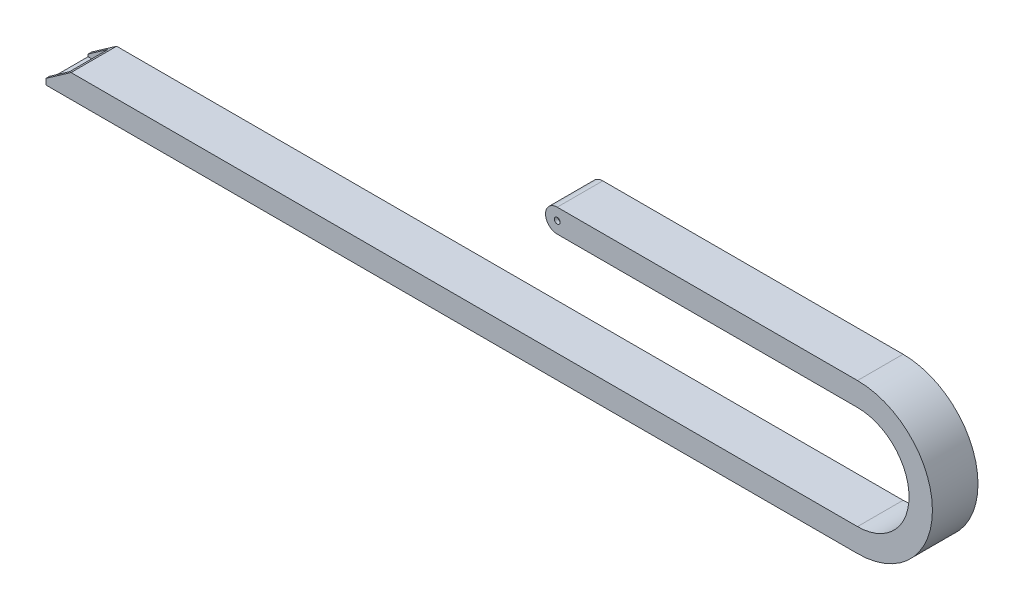
ISO-10303-21;
HEADER;
FILE_DESCRIPTION(('STEP AP214'),'2;1');
FILE_NAME('part.step','',(''),(''),'','','');
FILE_SCHEMA(('AUTOMOTIVE_DESIGN { 1 0 10303 214 1 1 1 1 }'));
ENDSEC;
DATA;
#1=APPLICATION_CONTEXT('core data for automotive mechanical design processes');
#2=APPLICATION_PROTOCOL_DEFINITION('international standard','automotive_design',2000,#1);
#3=PRODUCT_CONTEXT('',#1,'mechanical');
#4=PRODUCT('Part','Part','',(#3));
#5=PRODUCT_RELATED_PRODUCT_CATEGORY('part','',(#4));
#6=PRODUCT_DEFINITION_FORMATION('','',#4);
#7=PRODUCT_DEFINITION_CONTEXT('part definition',#1,'design');
#8=PRODUCT_DEFINITION('design','',#6,#7);
#9=PRODUCT_DEFINITION_SHAPE('','',#8);
#10=(LENGTH_UNIT() NAMED_UNIT(*) SI_UNIT(.MILLI.,.METRE.));
#11=(NAMED_UNIT(*) PLANE_ANGLE_UNIT() SI_UNIT($,.RADIAN.));
#12=(NAMED_UNIT(*) SI_UNIT($,.STERADIAN.) SOLID_ANGLE_UNIT());
#13=UNCERTAINTY_MEASURE_WITH_UNIT(LENGTH_MEASURE(1.E-05),#10,'distance_accuracy_value','');
#14=(GEOMETRIC_REPRESENTATION_CONTEXT(3) GLOBAL_UNCERTAINTY_ASSIGNED_CONTEXT((#13)) GLOBAL_UNIT_ASSIGNED_CONTEXT((#10,
#11,#12)) REPRESENTATION_CONTEXT('',''));
#15=CARTESIAN_POINT('',(0.,0.,0.));
#16=DIRECTION('',(0.,0.,1.));
#17=DIRECTION('',(1.,0.,0.));
#18=AXIS2_PLACEMENT_3D('',#15,#16,#17);
#19=CARTESIAN_POINT('',(-287.036202121073,-201.25,39.));
#20=DIRECTION('',(0.573576436351048,-0.819152044288991,0.));
#21=DIRECTION('',(0.819152044288991,0.573576436351048,0.));
#22=AXIS2_PLACEMENT_3D('',#19,#20,#21);
#23=PLANE('',#22);
#24=DIRECTION('',(-0.819152044288991,-0.573576436351048,0.));
#25=VECTOR('',#24,1.);
#26=CARTESIAN_POINT('',(-287.036202121073,-201.25,36.));
#27=LINE('',#26,#25);
#28=CARTESIAN_POINT('',(-291.3206461413,-204.25,36.));
#29=VERTEX_POINT('',#28);
#30=CARTESIAN_POINT('',(-308.458422222205,-216.25,36.));
#31=VERTEX_POINT('',#30);
#32=EDGE_CURVE('E56',#29,#31,#27,.T.);
#33=ORIENTED_EDGE('',*,*,#32,.T.);
#34=DIRECTION('',(0.,0.,-1.));
#35=VECTOR('',#34,1.);
#36=CARTESIAN_POINT('',(-308.458422222205,-216.25,39.));
#37=LINE('',#36,#35);
#38=CARTESIAN_POINT('',(-308.458422222205,-216.25,39.));
#39=VERTEX_POINT('',#38);
#40=EDGE_CURVE('E11',#39,#31,#37,.T.);
#41=ORIENTED_EDGE('',*,*,#40,.F.);
#42=DIRECTION('',(-0.819152044288991,-0.573576436351048,0.));
#43=VECTOR('',#42,1.);
#44=CARTESIAN_POINT('',(-287.036202121073,-201.25,39.));
#45=LINE('',#44,#43);
#46=CARTESIAN_POINT('',(-287.036202121073,-201.25,39.));
#47=VERTEX_POINT('',#46);
#48=EDGE_CURVE('E230',#47,#39,#45,.T.);
#49=ORIENTED_EDGE('',*,*,#48,.F.);
#50=DIRECTION('',(0.,0.,-1.));
#51=VECTOR('',#50,1.);
#52=CARTESIAN_POINT('',(-287.036202121073,-201.25,39.));
#53=LINE('',#52,#51);
#54=CARTESIAN_POINT('',(-287.036202121073,-201.25,0.));
#55=VERTEX_POINT('',#54);
#56=EDGE_CURVE('E250',#47,#55,#53,.T.);
#57=ORIENTED_EDGE('',*,*,#56,.T.);
#58=DIRECTION('',(-0.819152044288991,-0.573576436351048,0.));
#59=VECTOR('',#58,1.);
#60=CARTESIAN_POINT('',(-287.036202121073,-201.25,0.));
#61=LINE('',#60,#59);
#62=CARTESIAN_POINT('',(-308.458422222205,-216.25,0.));
#63=VERTEX_POINT('',#62);
#64=EDGE_CURVE('E196',#55,#63,#61,.T.);
#65=ORIENTED_EDGE('',*,*,#64,.T.);
#66=CARTESIAN_POINT('',(-308.458422222205,-216.25,3.));
#67=VERTEX_POINT('',#66);
#68=EDGE_CURVE('E41',#67,#63,#37,.T.);
#69=ORIENTED_EDGE('',*,*,#68,.F.);
#70=DIRECTION('',(-0.819152044288991,-0.573576436351048,0.));
#71=VECTOR('',#70,1.);
#72=CARTESIAN_POINT('',(-287.036202121073,-201.25,3.));
#73=LINE('',#72,#71);
#74=CARTESIAN_POINT('',(-291.3206461413,-204.25,3.));
#75=VERTEX_POINT('',#74);
#76=EDGE_CURVE('E171',#75,#67,#73,.T.);
#77=ORIENTED_EDGE('',*,*,#76,.F.);
#78=DIRECTION('',(0.,0.,-1.));
#79=VECTOR('',#78,1.);
#80=CARTESIAN_POINT('',(-291.3206461413,-204.25,39.));
#81=LINE('',#80,#79);
#82=EDGE_CURVE('E221',#29,#75,#81,.T.);
#83=ORIENTED_EDGE('',*,*,#82,.F.);
#84=EDGE_LOOP('',(#33,#41,#49,#57,#65,#69,#77,#83));
#85=FACE_BOUND('',#84,.T.);
#86=ADVANCED_FACE('F33',(#85),#23,.F.);
#87=CARTESIAN_POINT('',(-308.458422222205,-216.25,39.));
#88=DIRECTION('',(1.,0.,0.));
#89=DIRECTION('',(0.,0.,-1.));
#90=AXIS2_PLACEMENT_3D('',#87,#88,#89);
#91=PLANE('',#90);
#92=DIRECTION('',(0.,1.,0.));
#93=VECTOR('',#92,1.);
#94=CARTESIAN_POINT('',(-308.458422222205,-204.25,36.));
#95=LINE('',#94,#93);
#96=CARTESIAN_POINT('',(-308.458422222205,-218.25,36.));
#97=VERTEX_POINT('',#96);
#98=EDGE_CURVE('E179',#97,#31,#95,.T.);
#99=ORIENTED_EDGE('',*,*,#98,.F.);
#100=DIRECTION('',(0.,0.,1.));
#101=VECTOR('',#100,1.);
#102=CARTESIAN_POINT('',(-308.458422222205,-218.25,36.));
#103=LINE('',#102,#101);
#104=CARTESIAN_POINT('',(-308.458422222205,-218.25,3.));
#105=VERTEX_POINT('',#104);
#106=EDGE_CURVE('E164',#105,#97,#103,.T.);
#107=ORIENTED_EDGE('',*,*,#106,.F.);
#108=DIRECTION('',(0.,-1.,0.));
#109=VECTOR('',#108,1.);
#110=CARTESIAN_POINT('',(-308.458422222205,-204.25,3.));
#111=LINE('',#110,#109);
#112=EDGE_CURVE('E174',#67,#105,#111,.T.);
#113=ORIENTED_EDGE('',*,*,#112,.F.);
#114=ORIENTED_EDGE('',*,*,#68,.T.);
#115=DIRECTION('',(0.,-1.,0.));
#116=VECTOR('',#115,1.);
#117=CARTESIAN_POINT('',(-308.458422222205,-216.25,0.));
#118=LINE('',#117,#116);
#119=CARTESIAN_POINT('',(-308.458422222205,-221.25,0.));
#120=VERTEX_POINT('',#119);
#121=EDGE_CURVE('E253',#63,#120,#118,.T.);
#122=ORIENTED_EDGE('',*,*,#121,.T.);
#123=DIRECTION('',(0.,0.,-1.));
#124=VECTOR('',#123,1.);
#125=CARTESIAN_POINT('',(-308.458422222205,-221.25,39.));
#126=LINE('',#125,#124);
#127=CARTESIAN_POINT('',(-308.458422222205,-221.25,39.));
#128=VERTEX_POINT('',#127);
#129=EDGE_CURVE('E288',#128,#120,#126,.T.);
#130=ORIENTED_EDGE('',*,*,#129,.F.);
#131=DIRECTION('',(0.,-1.,0.));
#132=VECTOR('',#131,1.);
#133=CARTESIAN_POINT('',(-308.458422222205,-216.25,39.));
#134=LINE('',#133,#132);
#135=EDGE_CURVE('E233',#39,#128,#134,.T.);
#136=ORIENTED_EDGE('',*,*,#135,.F.);
#137=ORIENTED_EDGE('',*,*,#40,.T.);
#138=EDGE_LOOP('',(#99,#107,#113,#114,#122,#130,#136,#137));
#139=FACE_BOUND('',#138,.T.);
#140=ADVANCED_FACE('F181',(#139),#91,.F.);
#141=CARTESIAN_POINT('',(129.,-103.,39.));
#142=DIRECTION('',(0.,0.,-1.));
#143=DIRECTION('',(-1.,0.,0.));
#144=AXIS2_PLACEMENT_3D('',#141,#142,#143);
#145=CYLINDRICAL_SURFACE('',#144,10.);
#146=CARTESIAN_POINT('',(129.,-103.,0.));
#147=DIRECTION('',(0.,0.,1.));
#148=DIRECTION('',(1.,0.,0.));
#149=AXIS2_PLACEMENT_3D('',#146,#147,#148);
#150=CIRCLE('',#149,10.);
#151=CARTESIAN_POINT('',(129.,-93.,0.));
#152=VERTEX_POINT('',#151);
#153=CARTESIAN_POINT('',(129.,-113.,0.));
#154=VERTEX_POINT('',#153);
#155=EDGE_CURVE('E261',#152,#154,#150,.T.);
#156=ORIENTED_EDGE('',*,*,#155,.T.);
#157=DIRECTION('',(0.,0.,-1.));
#158=VECTOR('',#157,1.);
#159=CARTESIAN_POINT('',(129.,-113.,39.));
#160=LINE('',#159,#158);
#161=CARTESIAN_POINT('',(129.,-113.,39.));
#162=VERTEX_POINT('',#161);
#163=EDGE_CURVE('E276',#162,#154,#160,.T.);
#164=ORIENTED_EDGE('',*,*,#163,.F.);
#165=CARTESIAN_POINT('',(129.,-103.,39.));
#166=DIRECTION('',(0.,0.,1.));
#167=DIRECTION('',(1.,0.,0.));
#168=AXIS2_PLACEMENT_3D('',#165,#166,#167);
#169=CIRCLE('',#168,10.);
#170=CARTESIAN_POINT('',(129.,-93.,39.));
#171=VERTEX_POINT('',#170);
#172=EDGE_CURVE('E242',#171,#162,#169,.T.);
#173=ORIENTED_EDGE('',*,*,#172,.F.);
#174=DIRECTION('',(0.,0.,-1.));
#175=VECTOR('',#174,1.);
#176=CARTESIAN_POINT('',(129.,-93.,39.));
#177=LINE('',#176,#175);
#178=EDGE_CURVE('E279',#171,#152,#177,.T.);
#179=ORIENTED_EDGE('',*,*,#178,.T.);
#180=EDGE_LOOP('',(#156,#164,#173,#179));
#181=FACE_BOUND('',#180,.T.);
#182=CARTESIAN_POINT('',(129.,-103.,36.));
#183=DIRECTION('',(0.,0.,-1.));
#184=DIRECTION('',(-1.,0.,0.));
#185=AXIS2_PLACEMENT_3D('',#182,#183,#184);
#186=CIRCLE('',#185,10.);
#187=CARTESIAN_POINT('',(121.858571571457,-110.,36.));
#188=VERTEX_POINT('',#187);
#189=CARTESIAN_POINT('',(121.858571571457,-96.,36.));
#190=VERTEX_POINT('',#189);
#191=EDGE_CURVE('E192',#188,#190,#186,.T.);
#192=ORIENTED_EDGE('',*,*,#191,.F.);
#193=DIRECTION('',(0.,0.,-1.));
#194=VECTOR('',#193,1.);
#195=CARTESIAN_POINT('',(121.858571571457,-110.,39.));
#196=LINE('',#195,#194);
#197=CARTESIAN_POINT('',(121.858571571457,-110.,3.));
#198=VERTEX_POINT('',#197);
#199=EDGE_CURVE('E182',#198,#188,#196,.F.);
#200=ORIENTED_EDGE('',*,*,#199,.F.);
#201=CARTESIAN_POINT('',(129.,-103.,3.));
#202=DIRECTION('',(0.,0.,1.));
#203=DIRECTION('',(1.,0.,0.));
#204=AXIS2_PLACEMENT_3D('',#201,#202,#203);
#205=CIRCLE('',#204,10.);
#206=CARTESIAN_POINT('',(121.858571571457,-96.,3.));
#207=VERTEX_POINT('',#206);
#208=EDGE_CURVE('E190',#207,#198,#205,.T.);
#209=ORIENTED_EDGE('',*,*,#208,.F.);
#210=DIRECTION('',(0.,0.,-1.));
#211=VECTOR('',#210,1.);
#212=CARTESIAN_POINT('',(121.858571571457,-96.,39.));
#213=LINE('',#212,#211);
#214=EDGE_CURVE('E184',#190,#207,#213,.T.);
#215=ORIENTED_EDGE('',*,*,#214,.F.);
#216=EDGE_LOOP('',(#192,#200,#209,#215));
#217=FACE_BOUND('',#216,.T.);
#218=ADVANCED_FACE('F321',(#181,#217),#145,.T.);
#219=CARTESIAN_POINT('',(-308.458422222205,-221.25,39.));
#220=DIRECTION('',(0.,1.,0.));
#221=DIRECTION('',(-1.,0.,0.));
#222=AXIS2_PLACEMENT_3D('',#219,#220,#221);
#223=PLANE('',#222);
#224=DIRECTION('',(1.,0.,0.));
#225=VECTOR('',#224,1.);
#226=CARTESIAN_POINT('',(-308.458422222205,-221.25,0.));
#227=LINE('',#226,#225);
#228=CARTESIAN_POINT('',(385.962547751689,-221.25,0.));
#229=VERTEX_POINT('',#228);
#230=EDGE_CURVE('E255',#120,#229,#227,.T.);
#231=ORIENTED_EDGE('',*,*,#230,.T.);
#232=DIRECTION('',(0.,0.,-1.));
#233=VECTOR('',#232,1.);
#234=CARTESIAN_POINT('',(385.962547751689,-221.25,39.));
#235=LINE('',#234,#233);
#236=CARTESIAN_POINT('',(385.962547751689,-221.25,39.));
#237=VERTEX_POINT('',#236);
#238=EDGE_CURVE('E285',#237,#229,#235,.T.);
#239=ORIENTED_EDGE('',*,*,#238,.F.);
#240=DIRECTION('',(1.,0.,0.));
#241=VECTOR('',#240,1.);
#242=CARTESIAN_POINT('',(-308.458422222205,-221.25,39.));
#243=LINE('',#242,#241);
#244=EDGE_CURVE('E236',#128,#237,#243,.T.);
#245=ORIENTED_EDGE('',*,*,#244,.F.);
#246=ORIENTED_EDGE('',*,*,#129,.T.);
#247=EDGE_LOOP('',(#231,#239,#245,#246));
#248=FACE_BOUND('',#247,.T.);
#249=ADVANCED_FACE('F333',(#248),#223,.F.);
#250=CARTESIAN_POINT('',(385.962547751689,-157.125,39.));
#251=DIRECTION('',(0.,0.,-1.));
#252=DIRECTION('',(-1.,0.,0.));
#253=AXIS2_PLACEMENT_3D('',#250,#251,#252);
#254=CYLINDRICAL_SURFACE('',#253,64.125);
#255=CARTESIAN_POINT('',(385.962547751689,-157.125,0.));
#256=DIRECTION('',(0.,0.,1.));
#257=DIRECTION('',(1.,0.,0.));
#258=AXIS2_PLACEMENT_3D('',#255,#256,#257);
#259=CIRCLE('',#258,64.125);
#260=CARTESIAN_POINT('',(385.962547751689,-93.,0.));
#261=VERTEX_POINT('',#260);
#262=EDGE_CURVE('E257',#229,#261,#259,.T.);
#263=ORIENTED_EDGE('',*,*,#262,.T.);
#264=DIRECTION('',(0.,0.,-1.));
#265=VECTOR('',#264,1.);
#266=CARTESIAN_POINT('',(385.962547751689,-93.,39.));
#267=LINE('',#266,#265);
#268=CARTESIAN_POINT('',(385.962547751689,-93.,39.));
#269=VERTEX_POINT('',#268);
#270=EDGE_CURVE('E282',#269,#261,#267,.T.);
#271=ORIENTED_EDGE('',*,*,#270,.F.);
#272=CARTESIAN_POINT('',(385.962547751689,-157.125,39.));
#273=DIRECTION('',(0.,0.,1.));
#274=DIRECTION('',(1.,0.,0.));
#275=AXIS2_PLACEMENT_3D('',#272,#273,#274);
#276=CIRCLE('',#275,64.125);
#277=EDGE_CURVE('E238',#237,#269,#276,.T.);
#278=ORIENTED_EDGE('',*,*,#277,.F.);
#279=ORIENTED_EDGE('',*,*,#238,.T.);
#280=EDGE_LOOP('',(#263,#271,#278,#279));
#281=FACE_BOUND('',#280,.T.);
#282=ADVANCED_FACE('F331',(#281),#254,.T.);
#283=CARTESIAN_POINT('',(385.962547751689,-93.,39.));
#284=DIRECTION('',(0.,-1.,0.));
#285=DIRECTION('',(1.,0.,0.));
#286=AXIS2_PLACEMENT_3D('',#283,#284,#285);
#287=PLANE('',#286);
#288=DIRECTION('',(-1.,0.,0.));
#289=VECTOR('',#288,1.);
#290=CARTESIAN_POINT('',(385.962547751689,-93.,0.));
#291=LINE('',#290,#289);
#292=EDGE_CURVE('E259',#261,#152,#291,.T.);
#293=ORIENTED_EDGE('',*,*,#292,.T.);
#294=ORIENTED_EDGE('',*,*,#178,.F.);
#295=DIRECTION('',(-1.,0.,0.));
#296=VECTOR('',#295,1.);
#297=CARTESIAN_POINT('',(385.962547751689,-93.,39.));
#298=LINE('',#297,#296);
#299=EDGE_CURVE('E240',#269,#171,#298,.T.);
#300=ORIENTED_EDGE('',*,*,#299,.F.);
#301=ORIENTED_EDGE('',*,*,#270,.T.);
#302=EDGE_LOOP('',(#293,#294,#300,#301));
#303=FACE_BOUND('',#302,.T.);
#304=ADVANCED_FACE('F326',(#303),#287,.F.);
#305=CARTESIAN_POINT('',(129.,-113.,39.));
#306=DIRECTION('',(0.,1.,0.));
#307=DIRECTION('',(0.,0.,1.));
#308=AXIS2_PLACEMENT_3D('',#305,#306,#307);
#309=PLANE('',#308);
#310=DIRECTION('',(1.,0.,0.));
#311=VECTOR('',#310,1.);
#312=CARTESIAN_POINT('',(129.,-113.,0.));
#313=LINE('',#312,#311);
#314=CARTESIAN_POINT('',(385.962547751689,-113.,0.));
#315=VERTEX_POINT('',#314);
#316=EDGE_CURVE('E263',#154,#315,#313,.T.);
#317=ORIENTED_EDGE('',*,*,#316,.T.);
#318=DIRECTION('',(0.,0.,-1.));
#319=VECTOR('',#318,1.);
#320=CARTESIAN_POINT('',(385.962547751689,-113.,39.));
#321=LINE('',#320,#319);
#322=CARTESIAN_POINT('',(385.962547751689,-113.,39.));
#323=VERTEX_POINT('',#322);
#324=EDGE_CURVE('E273',#323,#315,#321,.T.);
#325=ORIENTED_EDGE('',*,*,#324,.F.);
#326=DIRECTION('',(1.,0.,0.));
#327=VECTOR('',#326,1.);
#328=CARTESIAN_POINT('',(129.,-113.,39.));
#329=LINE('',#328,#327);
#330=EDGE_CURVE('E244',#162,#323,#329,.T.);
#331=ORIENTED_EDGE('',*,*,#330,.F.);
#332=ORIENTED_EDGE('',*,*,#163,.T.);
#333=EDGE_LOOP('',(#317,#325,#331,#332));
#334=FACE_BOUND('',#333,.T.);
#335=ADVANCED_FACE('F317',(#334),#309,.F.);
#336=CARTESIAN_POINT('',(385.962547751689,-157.125,39.));
#337=DIRECTION('',(0.,0.,-1.));
#338=DIRECTION('',(-1.,0.,0.));
#339=AXIS2_PLACEMENT_3D('',#336,#337,#338);
#340=CYLINDRICAL_SURFACE('',#339,44.125);
#341=CARTESIAN_POINT('',(385.962547751689,-157.125,0.));
#342=DIRECTION('',(0.,0.,-1.));
#343=DIRECTION('',(1.,0.,0.));
#344=AXIS2_PLACEMENT_3D('',#341,#342,#343);
#345=CIRCLE('',#344,44.125);
#346=CARTESIAN_POINT('',(385.962547751689,-201.25,0.));
#347=VERTEX_POINT('',#346);
#348=EDGE_CURVE('E265',#315,#347,#345,.T.);
#349=ORIENTED_EDGE('',*,*,#348,.T.);
#350=DIRECTION('',(0.,0.,-1.));
#351=VECTOR('',#350,1.);
#352=CARTESIAN_POINT('',(385.962547751689,-201.25,39.));
#353=LINE('',#352,#351);
#354=CARTESIAN_POINT('',(385.962547751689,-201.25,39.));
#355=VERTEX_POINT('',#354);
#356=EDGE_CURVE('E270',#355,#347,#353,.T.);
#357=ORIENTED_EDGE('',*,*,#356,.F.);
#358=CARTESIAN_POINT('',(385.962547751689,-157.125,39.));
#359=DIRECTION('',(0.,0.,-1.));
#360=DIRECTION('',(1.,0.,0.));
#361=AXIS2_PLACEMENT_3D('',#358,#359,#360);
#362=CIRCLE('',#361,44.125);
#363=EDGE_CURVE('E246',#323,#355,#362,.T.);
#364=ORIENTED_EDGE('',*,*,#363,.F.);
#365=ORIENTED_EDGE('',*,*,#324,.T.);
#366=EDGE_LOOP('',(#349,#357,#364,#365));
#367=FACE_BOUND('',#366,.T.);
#368=ADVANCED_FACE('F312',(#367),#340,.F.);
#369=CARTESIAN_POINT('',(385.962547751689,-201.25,39.));
#370=DIRECTION('',(0.,-1.,0.));
#371=DIRECTION('',(1.,0.,0.));
#372=AXIS2_PLACEMENT_3D('',#369,#370,#371);
#373=PLANE('',#372);
#374=DIRECTION('',(-1.,0.,0.));
#375=VECTOR('',#374,1.);
#376=CARTESIAN_POINT('',(385.962547751689,-201.25,0.));
#377=LINE('',#376,#375);
#378=EDGE_CURVE('E234',#347,#55,#377,.T.);
#379=ORIENTED_EDGE('',*,*,#378,.T.);
#380=ORIENTED_EDGE('',*,*,#56,.F.);
#381=DIRECTION('',(-1.,0.,0.));
#382=VECTOR('',#381,1.);
#383=CARTESIAN_POINT('',(385.962547751689,-201.25,39.));
#384=LINE('',#383,#382);
#385=EDGE_CURVE('E248',#355,#47,#384,.T.);
#386=ORIENTED_EDGE('',*,*,#385,.F.);
#387=ORIENTED_EDGE('',*,*,#356,.T.);
#388=EDGE_LOOP('',(#379,#380,#386,#387));
#389=FACE_BOUND('',#388,.T.);
#390=ADVANCED_FACE('F306',(#389),#373,.F.);
#391=CARTESIAN_POINT('',(385.962547751689,-157.125,39.));
#392=DIRECTION('',(0.,0.,1.));
#393=DIRECTION('',(1.,0.,0.));
#394=AXIS2_PLACEMENT_3D('',#391,#392,#393);
#395=PLANE('',#394);
#396=CARTESIAN_POINT('',(129.,-103.,39.));
#397=DIRECTION('',(0.,0.,1.));
#398=DIRECTION('',(1.,0.,0.));
#399=AXIS2_PLACEMENT_3D('',#396,#397,#398);
#400=CIRCLE('',#399,2.50000000000002);
#401=CARTESIAN_POINT('',(131.5,-103.,39.));
#402=VERTEX_POINT('',#401);
#403=EDGE_CURVE('E344',#402,#402,#400,.T.);
#404=ORIENTED_EDGE('',*,*,#403,.F.);
#405=EDGE_LOOP('',(#404));
#406=FACE_BOUND('',#405,.T.);
#407=ORIENTED_EDGE('',*,*,#48,.T.);
#408=ORIENTED_EDGE('',*,*,#135,.T.);
#409=ORIENTED_EDGE('',*,*,#244,.T.);
#410=ORIENTED_EDGE('',*,*,#277,.T.);
#411=ORIENTED_EDGE('',*,*,#299,.T.);
#412=ORIENTED_EDGE('',*,*,#172,.T.);
#413=ORIENTED_EDGE('',*,*,#330,.T.);
#414=ORIENTED_EDGE('',*,*,#363,.T.);
#415=ORIENTED_EDGE('',*,*,#385,.T.);
#416=EDGE_LOOP('',(#407,#408,#409,#410,#411,#412,#413,#414,#415));
#417=FACE_BOUND('',#416,.T.);
#418=ADVANCED_FACE('F335',(#406,#417),#395,.T.);
#419=CARTESIAN_POINT('',(385.962547751689,-157.125,0.));
#420=DIRECTION('',(0.,0.,1.));
#421=DIRECTION('',(1.,0.,0.));
#422=AXIS2_PLACEMENT_3D('',#419,#420,#421);
#423=PLANE('',#422);
#424=CARTESIAN_POINT('',(129.,-103.,0.));
#425=DIRECTION('',(0.,0.,1.));
#426=DIRECTION('',(1.,0.,0.));
#427=AXIS2_PLACEMENT_3D('',#424,#425,#426);
#428=CIRCLE('',#427,2.50000000000002);
#429=CARTESIAN_POINT('',(131.5,-103.,0.));
#430=VERTEX_POINT('',#429);
#431=EDGE_CURVE('E347',#430,#430,#428,.T.);
#432=ORIENTED_EDGE('',*,*,#431,.T.);
#433=EDGE_LOOP('',(#432));
#434=FACE_BOUND('',#433,.T.);
#435=ORIENTED_EDGE('',*,*,#64,.F.);
#436=ORIENTED_EDGE('',*,*,#378,.F.);
#437=ORIENTED_EDGE('',*,*,#348,.F.);
#438=ORIENTED_EDGE('',*,*,#316,.F.);
#439=ORIENTED_EDGE('',*,*,#155,.F.);
#440=ORIENTED_EDGE('',*,*,#292,.F.);
#441=ORIENTED_EDGE('',*,*,#262,.F.);
#442=ORIENTED_EDGE('',*,*,#230,.F.);
#443=ORIENTED_EDGE('',*,*,#121,.F.);
#444=EDGE_LOOP('',(#435,#436,#437,#438,#439,#440,#441,#442,#443));
#445=FACE_BOUND('',#444,.T.);
#446=ADVANCED_FACE('F298',(#434,#445),#423,.F.);
#447=CARTESIAN_POINT('',(-308.458422222205,-218.25,39.));
#448=DIRECTION('',(0.,1.,0.));
#449=DIRECTION('',(-1.,0.,0.));
#450=AXIS2_PLACEMENT_3D('',#447,#448,#449);
#451=PLANE('',#450);
#452=DIRECTION('',(1.,0.,0.));
#453=VECTOR('',#452,1.);
#454=CARTESIAN_POINT('',(-308.458422222205,-218.25,3.));
#455=LINE('',#454,#453);
#456=CARTESIAN_POINT('',(385.962547751689,-218.25,3.));
#457=VERTEX_POINT('',#456);
#458=EDGE_CURVE('E160',#105,#457,#455,.T.);
#459=ORIENTED_EDGE('',*,*,#458,.F.);
#460=ORIENTED_EDGE('',*,*,#106,.T.);
#461=DIRECTION('',(1.,0.,0.));
#462=VECTOR('',#461,1.);
#463=CARTESIAN_POINT('',(-308.458422222205,-218.25,36.));
#464=LINE('',#463,#462);
#465=CARTESIAN_POINT('',(385.962547751689,-218.25,36.));
#466=VERTEX_POINT('',#465);
#467=EDGE_CURVE('E198',#97,#466,#464,.T.);
#468=ORIENTED_EDGE('',*,*,#467,.T.);
#469=DIRECTION('',(0.,0.,-1.));
#470=VECTOR('',#469,1.);
#471=CARTESIAN_POINT('',(385.962547751689,-218.25,39.));
#472=LINE('',#471,#470);
#473=EDGE_CURVE('E167',#466,#457,#472,.T.);
#474=ORIENTED_EDGE('',*,*,#473,.T.);
#475=EDGE_LOOP('',(#459,#460,#468,#474));
#476=FACE_BOUND('',#475,.T.);
#477=ADVANCED_FACE('F162',(#476),#451,.T.);
#478=CARTESIAN_POINT('',(385.962547751689,-157.125,39.));
#479=DIRECTION('',(0.,0.,-1.));
#480=DIRECTION('',(-1.,0.,0.));
#481=AXIS2_PLACEMENT_3D('',#478,#479,#480);
#482=CYLINDRICAL_SURFACE('',#481,61.125);
#483=CARTESIAN_POINT('',(385.962547751689,-157.125,3.));
#484=DIRECTION('',(0.,0.,1.));
#485=DIRECTION('',(1.,0.,0.));
#486=AXIS2_PLACEMENT_3D('',#483,#484,#485);
#487=CIRCLE('',#486,61.125);
#488=CARTESIAN_POINT('',(385.962547751689,-96.,3.));
#489=VERTEX_POINT('',#488);
#490=EDGE_CURVE('E170',#457,#489,#487,.T.);
#491=ORIENTED_EDGE('',*,*,#490,.F.);
#492=ORIENTED_EDGE('',*,*,#473,.F.);
#493=CARTESIAN_POINT('',(385.962547751689,-157.125,36.));
#494=DIRECTION('',(0.,0.,1.));
#495=DIRECTION('',(1.,0.,0.));
#496=AXIS2_PLACEMENT_3D('',#493,#494,#495);
#497=CIRCLE('',#496,61.125);
#498=CARTESIAN_POINT('',(385.962547751689,-96.,36.));
#499=VERTEX_POINT('',#498);
#500=EDGE_CURVE('E200',#466,#499,#497,.T.);
#501=ORIENTED_EDGE('',*,*,#500,.T.);
#502=DIRECTION('',(0.,0.,1.));
#503=VECTOR('',#502,1.);
#504=CARTESIAN_POINT('',(385.962547751689,-96.,39.));
#505=LINE('',#504,#503);
#506=EDGE_CURVE('E197',#499,#489,#505,.F.);
#507=ORIENTED_EDGE('',*,*,#506,.T.);
#508=EDGE_LOOP('',(#491,#492,#501,#507));
#509=FACE_BOUND('',#508,.T.);
#510=ADVANCED_FACE('F405',(#509),#482,.F.);
#511=CARTESIAN_POINT('',(385.962547751689,-96.,39.));
#512=DIRECTION('',(0.,-1.,0.));
#513=DIRECTION('',(1.,0.,0.));
#514=AXIS2_PLACEMENT_3D('',#511,#512,#513);
#515=PLANE('',#514);
#516=DIRECTION('',(-1.,0.,0.));
#517=VECTOR('',#516,1.);
#518=CARTESIAN_POINT('',(385.962547751689,-96.,3.));
#519=LINE('',#518,#517);
#520=EDGE_CURVE('E202',#489,#207,#519,.T.);
#521=ORIENTED_EDGE('',*,*,#520,.F.);
#522=ORIENTED_EDGE('',*,*,#506,.F.);
#523=DIRECTION('',(-1.,0.,0.));
#524=VECTOR('',#523,1.);
#525=CARTESIAN_POINT('',(385.962547751689,-96.,36.));
#526=LINE('',#525,#524);
#527=EDGE_CURVE('E207',#499,#190,#526,.T.);
#528=ORIENTED_EDGE('',*,*,#527,.T.);
#529=ORIENTED_EDGE('',*,*,#214,.T.);
#530=EDGE_LOOP('',(#521,#522,#528,#529));
#531=FACE_BOUND('',#530,.T.);
#532=ADVANCED_FACE('F408',(#531),#515,.T.);
#533=CARTESIAN_POINT('',(129.,-110.,39.));
#534=DIRECTION('',(0.,1.,0.));
#535=DIRECTION('',(0.,0.,1.));
#536=AXIS2_PLACEMENT_3D('',#533,#534,#535);
#537=PLANE('',#536);
#538=DIRECTION('',(1.,0.,0.));
#539=VECTOR('',#538,1.);
#540=CARTESIAN_POINT('',(129.,-110.,3.));
#541=LINE('',#540,#539);
#542=CARTESIAN_POINT('',(385.962547751689,-110.,3.));
#543=VERTEX_POINT('',#542);
#544=EDGE_CURVE('E48',#198,#543,#541,.T.);
#545=ORIENTED_EDGE('',*,*,#544,.F.);
#546=ORIENTED_EDGE('',*,*,#199,.T.);
#547=DIRECTION('',(1.,0.,0.));
#548=VECTOR('',#547,1.);
#549=CARTESIAN_POINT('',(129.,-110.,36.));
#550=LINE('',#549,#548);
#551=CARTESIAN_POINT('',(385.962547751689,-110.,36.));
#552=VERTEX_POINT('',#551);
#553=EDGE_CURVE('E210',#188,#552,#550,.T.);
#554=ORIENTED_EDGE('',*,*,#553,.T.);
#555=DIRECTION('',(0.,0.,-1.));
#556=VECTOR('',#555,1.);
#557=CARTESIAN_POINT('',(385.962547751689,-110.,39.));
#558=LINE('',#557,#556);
#559=EDGE_CURVE('E205',#552,#543,#558,.T.);
#560=ORIENTED_EDGE('',*,*,#559,.T.);
#561=EDGE_LOOP('',(#545,#546,#554,#560));
#562=FACE_BOUND('',#561,.T.);
#563=ADVANCED_FACE('F412',(#562),#537,.T.);
#564=CARTESIAN_POINT('',(385.962547751689,-157.125,39.));
#565=DIRECTION('',(0.,0.,-1.));
#566=DIRECTION('',(-1.,0.,0.));
#567=AXIS2_PLACEMENT_3D('',#564,#565,#566);
#568=CYLINDRICAL_SURFACE('',#567,47.1250000000001);
#569=CARTESIAN_POINT('',(385.962547751689,-157.125,3.));
#570=DIRECTION('',(0.,0.,1.));
#571=DIRECTION('',(1.,0.,0.));
#572=AXIS2_PLACEMENT_3D('',#569,#570,#571);
#573=CIRCLE('',#572,47.1250000000001);
#574=CARTESIAN_POINT('',(385.962547751689,-204.25,3.));
#575=VERTEX_POINT('',#574);
#576=EDGE_CURVE('E212',#543,#575,#573,.F.);
#577=ORIENTED_EDGE('',*,*,#576,.F.);
#578=ORIENTED_EDGE('',*,*,#559,.F.);
#579=CARTESIAN_POINT('',(385.962547751689,-157.125,36.));
#580=DIRECTION('',(0.,0.,1.));
#581=DIRECTION('',(1.,0.,0.));
#582=AXIS2_PLACEMENT_3D('',#579,#580,#581);
#583=CIRCLE('',#582,47.1250000000001);
#584=CARTESIAN_POINT('',(385.962547751689,-204.25,36.));
#585=VERTEX_POINT('',#584);
#586=EDGE_CURVE('E216',#552,#585,#583,.F.);
#587=ORIENTED_EDGE('',*,*,#586,.T.);
#588=DIRECTION('',(0.,0.,1.));
#589=VECTOR('',#588,1.);
#590=CARTESIAN_POINT('',(385.962547751689,-204.25,39.));
#591=LINE('',#590,#589);
#592=EDGE_CURVE('E214',#585,#575,#591,.F.);
#593=ORIENTED_EDGE('',*,*,#592,.T.);
#594=EDGE_LOOP('',(#577,#578,#587,#593));
#595=FACE_BOUND('',#594,.T.);
#596=ADVANCED_FACE('F416',(#595),#568,.T.);
#597=CARTESIAN_POINT('',(385.962547751689,-204.25,39.));
#598=DIRECTION('',(0.,-1.,0.));
#599=DIRECTION('',(1.,0.,0.));
#600=AXIS2_PLACEMENT_3D('',#597,#598,#599);
#601=PLANE('',#600);
#602=DIRECTION('',(-1.,0.,0.));
#603=VECTOR('',#602,1.);
#604=CARTESIAN_POINT('',(385.962547751689,-204.25,3.));
#605=LINE('',#604,#603);
#606=EDGE_CURVE('E218',#575,#75,#605,.T.);
#607=ORIENTED_EDGE('',*,*,#606,.F.);
#608=ORIENTED_EDGE('',*,*,#592,.F.);
#609=DIRECTION('',(-1.,0.,0.));
#610=VECTOR('',#609,1.);
#611=CARTESIAN_POINT('',(385.962547751689,-204.25,36.));
#612=LINE('',#611,#610);
#613=EDGE_CURVE('E223',#585,#29,#612,.T.);
#614=ORIENTED_EDGE('',*,*,#613,.T.);
#615=ORIENTED_EDGE('',*,*,#82,.T.);
#616=EDGE_LOOP('',(#607,#608,#614,#615));
#617=FACE_BOUND('',#616,.T.);
#618=ADVANCED_FACE('F365',(#617),#601,.T.);
#619=CARTESIAN_POINT('',(385.962547751689,-157.125,36.));
#620=DIRECTION('',(0.,0.,1.));
#621=DIRECTION('',(1.,0.,0.));
#622=AXIS2_PLACEMENT_3D('',#619,#620,#621);
#623=PLANE('',#622);
#624=CARTESIAN_POINT('',(129.,-103.,36.));
#625=DIRECTION('',(0.,0.,1.));
#626=DIRECTION('',(1.,0.,0.));
#627=AXIS2_PLACEMENT_3D('',#624,#625,#626);
#628=CIRCLE('',#627,2.50000000000002);
#629=CARTESIAN_POINT('',(131.5,-103.,36.));
#630=VERTEX_POINT('',#629);
#631=EDGE_CURVE('E340',#630,#630,#628,.T.);
#632=ORIENTED_EDGE('',*,*,#631,.T.);
#633=EDGE_LOOP('',(#632));
#634=FACE_BOUND('',#633,.T.);
#635=ORIENTED_EDGE('',*,*,#586,.F.);
#636=ORIENTED_EDGE('',*,*,#553,.F.);
#637=ORIENTED_EDGE('',*,*,#191,.T.);
#638=ORIENTED_EDGE('',*,*,#527,.F.);
#639=ORIENTED_EDGE('',*,*,#500,.F.);
#640=ORIENTED_EDGE('',*,*,#467,.F.);
#641=ORIENTED_EDGE('',*,*,#98,.T.);
#642=ORIENTED_EDGE('',*,*,#32,.F.);
#643=ORIENTED_EDGE('',*,*,#613,.F.);
#644=EDGE_LOOP('',(#635,#636,#637,#638,#639,#640,#641,#642,#643));
#645=FACE_BOUND('',#644,.T.);
#646=ADVANCED_FACE('F338',(#634,#645),#623,.F.);
#647=CARTESIAN_POINT('',(385.962547751689,-157.125,3.));
#648=DIRECTION('',(0.,0.,1.));
#649=DIRECTION('',(1.,0.,0.));
#650=AXIS2_PLACEMENT_3D('',#647,#648,#649);
#651=PLANE('',#650);
#652=CARTESIAN_POINT('',(129.,-103.,3.));
#653=DIRECTION('',(0.,0.,1.));
#654=DIRECTION('',(1.,0.,0.));
#655=AXIS2_PLACEMENT_3D('',#652,#653,#654);
#656=CIRCLE('',#655,2.50000000000002);
#657=CARTESIAN_POINT('',(131.5,-103.,3.));
#658=VERTEX_POINT('',#657);
#659=EDGE_CURVE('E36',#658,#658,#656,.T.);
#660=ORIENTED_EDGE('',*,*,#659,.F.);
#661=EDGE_LOOP('',(#660));
#662=FACE_BOUND('',#661,.T.);
#663=ORIENTED_EDGE('',*,*,#490,.T.);
#664=ORIENTED_EDGE('',*,*,#520,.T.);
#665=ORIENTED_EDGE('',*,*,#208,.T.);
#666=ORIENTED_EDGE('',*,*,#544,.T.);
#667=ORIENTED_EDGE('',*,*,#576,.T.);
#668=ORIENTED_EDGE('',*,*,#606,.T.);
#669=ORIENTED_EDGE('',*,*,#76,.T.);
#670=ORIENTED_EDGE('',*,*,#112,.T.);
#671=ORIENTED_EDGE('',*,*,#458,.T.);
#672=EDGE_LOOP('',(#663,#664,#665,#666,#667,#668,#669,#670,#671));
#673=FACE_BOUND('',#672,.T.);
#674=ADVANCED_FACE('F175',(#662,#673),#651,.T.);
#675=CARTESIAN_POINT('',(129.,-103.,0.));
#676=DIRECTION('',(0.,0.,1.));
#677=DIRECTION('',(1.,0.,0.));
#678=AXIS2_PLACEMENT_3D('',#675,#676,#677);
#679=CYLINDRICAL_SURFACE('',#678,2.50000000000002);
#680=ORIENTED_EDGE('',*,*,#659,.T.);
#681=EDGE_LOOP('',(#680));
#682=FACE_BOUND('',#681,.T.);
#683=ORIENTED_EDGE('',*,*,#431,.F.);
#684=EDGE_LOOP('',(#683));
#685=FACE_BOUND('',#684,.T.);
#686=ADVANCED_FACE('F354',(#682,#685),#679,.F.);
#687=ORIENTED_EDGE('',*,*,#403,.T.);
#688=EDGE_LOOP('',(#687));
#689=FACE_BOUND('',#688,.T.);
#690=ORIENTED_EDGE('',*,*,#631,.F.);
#691=EDGE_LOOP('',(#690));
#692=FACE_BOUND('',#691,.T.);
#693=ADVANCED_FACE('F363',(#689,#692),#679,.F.);
#694=CLOSED_SHELL('',(#86,#140,#218,#249,#282,#304,#335,#368,#390,#418,#446,#477,#510,#532,#563,
#596,#618,#646,#674,#686,#693));
#695=MANIFOLD_SOLID_BREP('B2',#694);
#696=ADVANCED_BREP_SHAPE_REPRESENTATION('',(#18,#695),#14);
#697=SHAPE_DEFINITION_REPRESENTATION(#9,#696);
ENDSEC;
END-ISO-10303-21;
